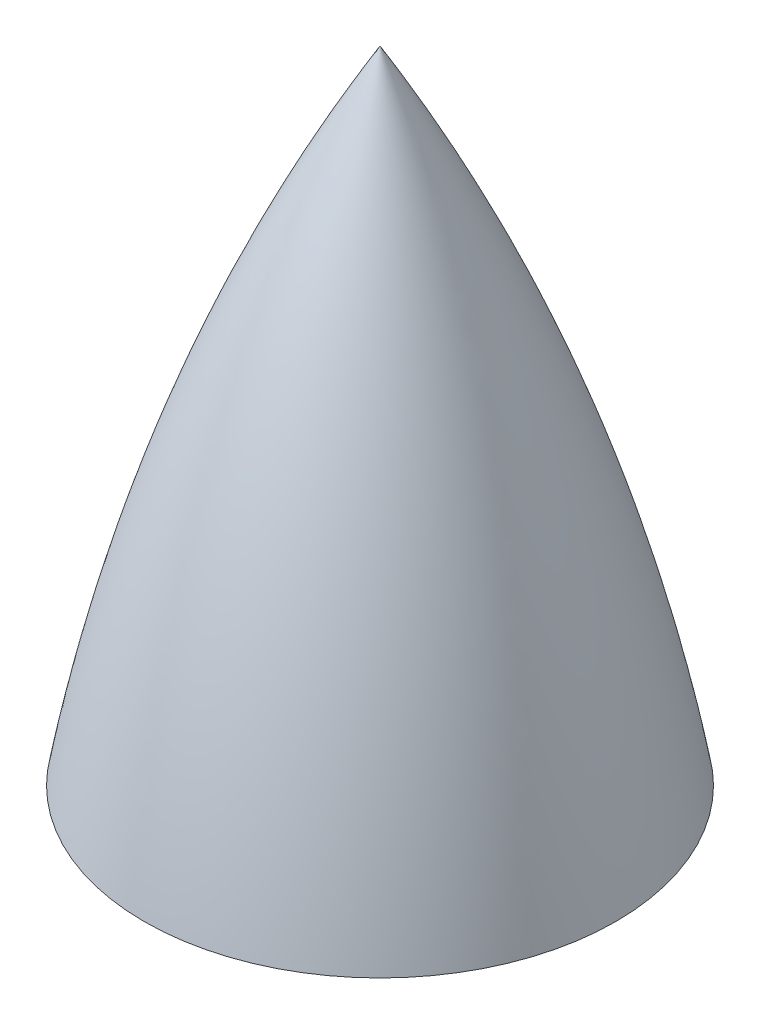
ISO-10303-21;
HEADER;
FILE_DESCRIPTION(('STEP AP214'),'2;1');
FILE_NAME('part.step','',(''),(''),'','','');
FILE_SCHEMA(('AUTOMOTIVE_DESIGN { 1 0 10303 214 1 1 1 1 }'));
ENDSEC;
DATA;
#1=APPLICATION_CONTEXT('core data for automotive mechanical design processes');
#2=APPLICATION_PROTOCOL_DEFINITION('international standard','automotive_design',2000,#1);
#3=PRODUCT_CONTEXT('',#1,'mechanical');
#4=PRODUCT('Part','Part','',(#3));
#5=PRODUCT_RELATED_PRODUCT_CATEGORY('part','',(#4));
#6=PRODUCT_DEFINITION_FORMATION('','',#4);
#7=PRODUCT_DEFINITION_CONTEXT('part definition',#1,'design');
#8=PRODUCT_DEFINITION('design','',#6,#7);
#9=PRODUCT_DEFINITION_SHAPE('','',#8);
#10=(LENGTH_UNIT() NAMED_UNIT(*) SI_UNIT(.MILLI.,.METRE.));
#11=(NAMED_UNIT(*) PLANE_ANGLE_UNIT() SI_UNIT($,.RADIAN.));
#12=(NAMED_UNIT(*) SI_UNIT($,.STERADIAN.) SOLID_ANGLE_UNIT());
#13=UNCERTAINTY_MEASURE_WITH_UNIT(LENGTH_MEASURE(1.E-05),#10,'distance_accuracy_value','');
#14=(GEOMETRIC_REPRESENTATION_CONTEXT(3) GLOBAL_UNCERTAINTY_ASSIGNED_CONTEXT((#13)) GLOBAL_UNIT_ASSIGNED_CONTEXT((#10,
#11,#12)) REPRESENTATION_CONTEXT('',''));
#15=CARTESIAN_POINT('',(0.,0.,0.));
#16=DIRECTION('',(0.,0.,1.));
#17=DIRECTION('',(1.,0.,0.));
#18=AXIS2_PLACEMENT_3D('',#15,#16,#17);
#19=CARTESIAN_POINT('',(-51.8,5.23291670442619,0.));
#20=DIRECTION('',(0.,1.,0.));
#21=DIRECTION('',(-1.,0.,0.));
#22=AXIS2_PLACEMENT_3D('',#19,#20,#21);
#23=PLANE('',#22);
#24=CARTESIAN_POINT('',(0.,5.23291670442619,0.));
#25=DIRECTION('',(0.,1.,0.));
#26=DIRECTION('',(-1.,0.,0.));
#27=AXIS2_PLACEMENT_3D('',#24,#25,#26);
#28=CIRCLE('',#27,55.);
#29=CARTESIAN_POINT('',(-55.,5.23291670442619,0.));
#30=VERTEX_POINT('',#29);
#31=EDGE_CURVE('E11',#30,#30,#28,.T.);
#32=ORIENTED_EDGE('',*,*,#31,.F.);
#33=EDGE_LOOP('',(#32));
#34=FACE_BOUND('',#33,.T.);
#35=CARTESIAN_POINT('',(0.,5.23291670442619,0.));
#36=DIRECTION('',(0.,1.,0.));
#37=DIRECTION('',(-1.,0.,0.));
#38=AXIS2_PLACEMENT_3D('',#35,#36,#37);
#39=CIRCLE('',#38,51.8);
#40=CARTESIAN_POINT('',(-51.8,5.23291670442619,0.));
#41=VERTEX_POINT('',#40);
#42=EDGE_CURVE('E58',#41,#41,#39,.T.);
#43=ORIENTED_EDGE('',*,*,#42,.T.);
#44=EDGE_LOOP('',(#43));
#45=FACE_BOUND('',#44,.T.);
#46=ADVANCED_FACE('F46',(#34,#45),#23,.F.);
#47=CARTESIAN_POINT('',(0.,149.475241281921,0.));
#48=CARTESIAN_POINT('',(-38.2411653020512,81.6235108823369,0.));
#49=CARTESIAN_POINT('',(-51.8,5.23291670442619,0.));
#50=B_SPLINE_CURVE_WITH_KNOTS('',2,(#47,#48,#49),.UNSPECIFIED.,.F.,.F.,(3,3),(0.,1.),.UNSPECIFIED.);
#51=CARTESIAN_POINT('',(0.,154.591981723671,0.));
#52=DIRECTION('',(0.,1.,0.));
#53=AXIS1_PLACEMENT('',#51,#52);
#54=SURFACE_OF_REVOLUTION('',#50,#53);
#55=ORIENTED_EDGE('',*,*,#42,.F.);
#56=EDGE_LOOP('',(#55));
#57=FACE_BOUND('',#56,.T.);
#58=CARTESIAN_POINT('',(-33.3390978625183,75.909034202137,0.));
#59=CARTESIAN_POINT('',(-33.3391045656254,75.9090330205368,-0.867979774072332));
#60=CARTESIAN_POINT('',(-33.3029575918185,75.9154067099841,-1.73585552885516));
#61=CARTESIAN_POINT('',(-33.1586489808093,75.9408522136266,-3.4656956056568));
#62=CARTESIAN_POINT('',(-33.0504684150183,75.9599273654418,-4.32765831371415));
#63=CARTESIAN_POINT('',(-32.7627508456799,76.0106597352109,-6.04017126253381));
#64=CARTESIAN_POINT('',(-32.5831357522762,76.0423307225144,-6.89070795736923));
#65=CARTESIAN_POINT('',(-32.1539625083414,76.1180055449604,-8.57332742574391));
#66=CARTESIAN_POINT('',(-31.9044089622886,76.1620085682092,-9.40541141024811));
#67=CARTESIAN_POINT('',(-31.3375021591597,76.2619695331103,-11.0446696532443));
#68=CARTESIAN_POINT('',(-31.0202025253331,76.3179180195369,-11.8518630384976));
#69=CARTESIAN_POINT('',(-30.3201029928275,76.4413644563096,-13.4364176614086));
#70=CARTESIAN_POINT('',(-29.9373021534747,76.5088625725218,-14.2137784704393));
#71=CARTESIAN_POINT('',(-29.1091883302709,76.6548813826481,-15.7331283944811));
#72=CARTESIAN_POINT('',(-28.6638900345743,76.7333994866441,-16.475125765878));
#73=CARTESIAN_POINT('',(-27.7140291240313,76.9008855930944,-17.9189106312184));
#74=CARTESIAN_POINT('',(-27.2094663274143,76.9898536275997,-18.6206980018237));
#75=CARTESIAN_POINT('',(-26.1403321573113,77.1783708277866,-19.9850473142587));
#76=CARTESIAN_POINT('',(-25.575295018701,77.2780021204263,-20.6472329189238));
#77=CARTESIAN_POINT('',(-24.3928829347699,77.4864932731398,-21.9215216319623));
#78=CARTESIAN_POINT('',(-23.7755077360001,77.5953531779034,-22.5336244977801));
#79=CARTESIAN_POINT('',(-22.4928343923468,77.8215230958258,-23.7037721132169));
#80=CARTESIAN_POINT('',(-21.8275319971561,77.9388338584282,-24.2618120580815));
#81=CARTESIAN_POINT('',(-20.453796612432,78.1810604711097,-25.3201635232266));
#82=CARTESIAN_POINT('',(-19.7453632037251,78.3059763951004,-25.8204744823248));
#83=CARTESIAN_POINT('',(-18.2794800821418,78.5644511400015,-26.7671948467975));
#84=CARTESIAN_POINT('',(-17.5214566814593,78.6981111175507,-27.2126885047088));
#85=CARTESIAN_POINT('',(-15.9715189143663,78.971406964309,-28.0380477362903));
#86=CARTESIAN_POINT('',(-15.1796042408283,79.1110428876731,-28.4179127150671));
#87=CARTESIAN_POINT('',(-13.5674145924137,79.3953154207084,-29.1096155849006));
#88=CARTESIAN_POINT('',(-12.7471378866126,79.5399523355883,-29.4214493155154));
#89=CARTESIAN_POINT('',(-11.0839811421251,79.8332117427896,-29.9751008499037));
#90=CARTESIAN_POINT('',(-10.2411009258116,79.9818342664315,-30.2169181032843));
#91=CARTESIAN_POINT('',(-8.52636163601416,80.2841890681046,-30.6319804205765));
#92=CARTESIAN_POINT('',(-7.65426048714819,80.437964030557,-30.8041948587747));
#93=CARTESIAN_POINT('',(-5.89892550754302,80.7474769476437,-31.0739461899926));
#94=CARTESIAN_POINT('',(-5.01569156704864,80.9032149216308,-31.171482346193));
#95=CARTESIAN_POINT('',(-3.24424595580308,81.215568577752,-31.2912645752408));
#96=CARTESIAN_POINT('',(-2.35603406274825,81.3721842990842,-31.3135072583867));
#97=CARTESIAN_POINT('',(-0.580885466582036,81.685190891356,-31.2825558113269));
#98=CARTESIAN_POINT('',(0.306051233223599,81.8415817617127,-31.2293614859131));
#99=CARTESIAN_POINT('',(2.07911278556175,82.1542203518478,-31.047188124951));
#100=CARTESIAN_POINT('',(2.96518103179961,82.310458090409,-30.9176403735178));
#101=CARTESIAN_POINT('',(4.72341221208547,82.6204816858173,-30.5831417375064));
#102=CARTESIAN_POINT('',(5.59557505418572,82.7742675264514,-30.3781903545466));
#103=CARTESIAN_POINT('',(7.31974853320821,83.078285830226,-29.8942103160308));
#104=CARTESIAN_POINT('',(8.17175896389443,83.2285182570015,-29.6151809027309));
#105=CARTESIAN_POINT('',(9.84945560777473,83.5243414407626,-28.9848698320725));
#106=CARTESIAN_POINT('',(10.675141938953,83.6699322185519,-28.6335884985985));
#107=CARTESIAN_POINT('',(12.2920014838693,83.9550281803376,-27.8621242549295));
#108=CARTESIAN_POINT('',(13.0832608122219,84.0945485486638,-27.4421274655278));
#109=CARTESIAN_POINT('',(14.6277756243239,84.3668881821421,-26.5353696963413));
#110=CARTESIAN_POINT('',(15.3810310935059,84.4997074447255,-26.0486086909652));
#111=CARTESIAN_POINT('',(16.8438855977865,84.7576481626819,-25.0116322657778));
#112=CARTESIAN_POINT('',(17.5534862711388,84.8827699069232,-24.4614192293907));
#113=CARTESIAN_POINT('',(18.9236785487163,85.1243717742193,-23.3013049551382));
#114=CARTESIAN_POINT('',(19.5842706553073,85.2408519858547,-22.6914043292535));
#115=CARTESIAN_POINT('',(20.8438159927327,85.462943812269,-21.4237694133546));
#116=CARTESIAN_POINT('',(21.4434092221525,85.5686682760662,-20.7666907695629));
#117=CARTESIAN_POINT('',(22.5852006098291,85.7699969040547,-19.4029759129949));
#118=CARTESIAN_POINT('',(23.1273991317554,85.8656011323709,-18.6963400142749));
#119=CARTESIAN_POINT('',(24.1501566148264,86.0459408713584,-17.2385445804225));
#120=CARTESIAN_POINT('',(24.6307197326704,86.1306771149679,-16.4873880527678));
#121=CARTESIAN_POINT('',(25.5264578782687,86.2886199176871,-14.9458950023414));
#122=CARTESIAN_POINT('',(25.941633647557,86.3618266075493,-14.1555589240244));
#123=CARTESIAN_POINT('',(26.6972355926676,86.4950596171485,-12.5542705583192));
#124=CARTESIAN_POINT('',(27.038743179629,86.5552766188466,-11.7438442790959));
#125=CARTESIAN_POINT('',(27.6525423647945,86.6635059759285,-10.0964007412647));
#126=CARTESIAN_POINT('',(27.9248346795415,86.7115184576581,-9.25938375803485));
#127=CARTESIAN_POINT('',(28.3980328625579,86.7949560645464,-7.56485180677454));
#128=CARTESIAN_POINT('',(28.5989433570014,86.8303820054244,-6.70733817095436));
#129=CARTESIAN_POINT('',(28.9277974674068,86.8883678578059,-4.97800330764798));
#130=CARTESIAN_POINT('',(29.0557415894491,86.9109278585451,-4.1061821794389));
#131=CARTESIAN_POINT('',(29.2364895421421,86.9427985993128,-2.36567709036357));
#132=CARTESIAN_POINT('',(29.2902210746168,86.9522729182029,-1.49709233822113));
#133=CARTESIAN_POINT('',(29.3251274106229,86.9584278470385,0.241574341554131));
#134=CARTESIAN_POINT('',(29.3063029039545,86.9551085786143,1.11165625487464));
#135=CARTESIAN_POINT('',(29.1962477897447,86.9357028926141,2.84705502994566));
#136=CARTESIAN_POINT('',(29.1050195334294,86.9196168896227,3.71237204551181));
#137=CARTESIAN_POINT('',(28.8508754453666,86.8748044299095,5.43208131002322));
#138=CARTESIAN_POINT('',(28.6879595926616,86.8460779694924,6.28647355577461));
#139=CARTESIAN_POINT('',(28.2924501098097,86.7763389765394,7.97510302517676));
#140=CARTESIAN_POINT('',(28.0601175947838,86.7353724856443,8.80940333575099));
#141=CARTESIAN_POINT('',(27.5273503243779,86.641431241433,10.4552655537757));
#142=CARTESIAN_POINT('',(27.2269158593467,86.5884565393132,11.2668275581529));
#143=CARTESIAN_POINT('',(26.560232276727,86.4709022361016,12.8615861986715));
#144=CARTESIAN_POINT('',(26.1939824668731,86.4063225129448,13.6447825363501));
#145=CARTESIAN_POINT('',(25.3984318707414,86.2660454783276,15.1774269543634));
#146=CARTESIAN_POINT('',(24.9691306671369,86.1903480932813,15.9268748112796));
#147=CARTESIAN_POINT('',(24.0475960269438,86.0278566725573,17.3918355557631));
#148=CARTESIAN_POINT('',(23.5549603072755,85.9409917035187,18.1070875067309));
#149=CARTESIAN_POINT('',(22.5126967663455,85.7572125202435,19.4934019280248));
#150=CARTESIAN_POINT('',(21.9630687919679,85.6602982790083,20.1644642796226));
#151=CARTESIAN_POINT('',(20.8108222019037,85.45712611675,21.4579633137081));
#152=CARTESIAN_POINT('',(20.2082011044806,85.3508677581298,22.0803977163054));
#153=CARTESIAN_POINT('',(18.9543374702073,85.1297777692776,23.2725333450623));
#154=CARTESIAN_POINT('',(18.3030944611302,85.0149460557792,23.8422340589399));
#155=CARTESIAN_POINT('',(16.9471347106014,84.7758537670055,24.932853349057));
#156=CARTESIAN_POINT('',(16.2417945341881,84.6514832633257,25.4529728115843));
#157=CARTESIAN_POINT('',(14.7909463768884,84.3956595882818,26.4318164964166));
#158=CARTESIAN_POINT('',(14.0454380660753,84.2642063587427,26.8905402143313));
#159=CARTESIAN_POINT('',(12.5194930810633,83.9951410868075,27.7436738305854));
#160=CARTESIAN_POINT('',(11.7390542526843,83.8575286645713,28.1380797554345));
#161=CARTESIAN_POINT('',(10.1487486824704,83.5771148849707,28.860049527611));
#162=CARTESIAN_POINT('',(9.33888167980631,83.4343134816151,29.187612782325));
#163=CARTESIAN_POINT('',(7.68268956970601,83.1422821273671,29.7783510693503));
#164=CARTESIAN_POINT('',(6.83599559401702,82.9929871350493,30.040460180742));
#165=CARTESIAN_POINT('',(5.12401129697342,82.6911181129304,30.4919810153136));
#166=CARTESIAN_POINT('',(4.25872078611678,82.5385440497149,30.6813919973153));
#167=CARTESIAN_POINT('',(2.51555465453599,82.231176828859,30.9863245274382));
#168=CARTESIAN_POINT('',(1.63767832844585,82.0763835468436,31.1018419175468));
#169=CARTESIAN_POINT('',(-0.124498553446834,81.7656642177842,31.2582421675711));
#170=CARTESIAN_POINT('',(-1.00879913731938,81.6097381657907,31.299124701182));
#171=CARTESIAN_POINT('',(-2.78657739048763,81.2962678940394,31.3060289145664));
#172=CARTESIAN_POINT('',(-3.68005799920503,81.1387231559823,31.2712943449618));
#173=CARTESIAN_POINT('',(-5.46098173463419,80.8246982508411,31.125634454295));
#174=CARTESIAN_POINT('',(-6.34842481322489,80.668218092242,31.0147085266801));
#175=CARTESIAN_POINT('',(-8.11098472736792,80.3574312242624,30.717370077456));
#176=CARTESIAN_POINT('',(-8.9861012836345,80.2031245641275,30.5309558483234));
#177=CARTESIAN_POINT('',(-10.7177333193745,79.8977911155664,30.0838401675065));
#178=CARTESIAN_POINT('',(-11.5742488450839,79.7467643189877,29.8231389004982));
#179=CARTESIAN_POINT('',(-13.2628189198231,79.4490238559934,29.229034294176));
#180=CARTESIAN_POINT('',(-14.0948645371117,79.3023117644847,28.8956047731516));
#181=CARTESIAN_POINT('',(-15.7281175816094,79.0143251864146,28.1582887083187));
#182=CARTESIAN_POINT('',(-16.5293249311414,78.8730507135497,27.7544019870532));
#183=CARTESIAN_POINT('',(-18.0949460840126,78.5969894627298,26.8788903493538));
#184=CARTESIAN_POINT('',(-18.8593621836855,78.4622022798691,26.4072696678887));
#185=CARTESIAN_POINT('',(-20.3457393527171,78.200113881459,25.3994625823472));
#186=CARTESIAN_POINT('',(-21.0677008437685,78.0728125915537,24.8632768197434));
#187=CARTESIAN_POINT('',(-22.4569303239842,77.8278539517953,23.7355198143693));
#188=CARTESIAN_POINT('',(-23.1246605436407,77.7101150982351,23.1445356670188));
#189=CARTESIAN_POINT('',(-24.4080822965665,77.4838132155654,21.9069091581142));
#190=CARTESIAN_POINT('',(-25.0237738555156,77.3752501819278,21.2602668240265));
#191=CARTESIAN_POINT('',(-26.1985076574018,77.1681129175046,19.9157012278156));
#192=CARTESIAN_POINT('',(-26.7575386524883,77.0695406700185,19.2177678310085));
#193=CARTESIAN_POINT('',(-27.8144413491436,76.8831802086134,17.7756989598424));
#194=CARTESIAN_POINT('',(-28.3123147508968,76.795391694906,17.0315647707341));
#195=CARTESIAN_POINT('',(-29.2360851646562,76.6325060469819,15.513770504683));
#196=CARTESIAN_POINT('',(-29.6629383339536,76.5572403164369,14.74071037083));
#197=CARTESIAN_POINT('',(-30.4501754961652,76.4184291645132,13.1603821836474));
#198=CARTESIAN_POINT('',(-30.8105555592318,76.3548844360727,12.3531121113154));
#199=CARTESIAN_POINT('',(-31.46158017195,76.2400912317784,10.7111896296466));
#200=CARTESIAN_POINT('',(-31.752307978565,76.1888280754756,9.8765712813025));
#201=CARTESIAN_POINT('',(-32.262197050315,76.0989208748323,8.18539522657385));
#202=CARTESIAN_POINT('',(-32.4813783597036,76.060273296149,7.32884373756054));
#203=CARTESIAN_POINT('',(-32.8880686755704,75.9885628211886,5.40301143080623));
#204=CARTESIAN_POINT('',(-33.0570455812643,75.9587676344937,4.3296432212827));
#205=CARTESIAN_POINT('',(-33.2825553792746,75.9190041703259,2.17079571005842));
#206=CARTESIAN_POINT('',(-33.3390894809947,75.9090356796026,1.08531653874612));
#207=CARTESIAN_POINT('',(-33.3390978625183,75.909034202137,0.));
#208=B_SPLINE_CURVE_WITH_KNOTS('',3,(#58,#59,#60,#61,#62,#63,#64,#65,#66,#67,#68,#69,#70,#71,
#72,#73,#74,#75,#76,#77,#78,#79,#80,#81,#82,#83,#84,#85,#86,#87,#88,#89,#90,#91,#92,#93,#94,#95,
#96,#97,#98,#99,#100,#101,#102,#103,#104,#105,#106,#107,#108,#109,#110,#111,#112,#113,#114,#115,
#116,#117,#118,#119,#120,#121,#122,#123,#124,#125,#126,#127,#128,#129,#130,#131,#132,#133,#134,
#135,#136,#137,#138,#139,#140,#141,#142,#143,#144,#145,#146,#147,#148,#149,#150,#151,#152,#153,
#154,#155,#156,#157,#158,#159,#160,#161,#162,#163,#164,#165,#166,#167,#168,#169,#170,#171,#172,
#173,#174,#175,#176,#177,#178,#179,#180,#181,#182,#183,#184,#185,#186,#187,#188,#189,#190,#191,
#192,#193,#194,#195,#196,#197,#198,#199,#200,#201,#202,#203,#204,#205,#206,#207),.UNSPECIFIED.,
.T.,.F.,(4,2,2,2,2,2,2,2,2,2,2,2,2,2,2,2,2,2,2,2,2,2,2,2,2,2,2,2,2,2,2,2,2,2,2,2,2,2,2,2,2,2,2,
2,2,2,2,2,2,2,2,2,2,2,2,2,2,2,2,2,2,2,2,2,2,2,2,2,2,2,2,2,2,2,4),(0.,2.60298531183563,
5.20665489182676,7.81317857505401,10.4195306951032,13.0238273999141,15.6281615086071,
18.2318845683549,20.8356156142116,23.4610813981591,26.0865598967442,28.7122715168253,
31.3380086592457,34.0029280506111,36.6678715969624,39.3329780719237,41.9981054964647,
44.7013652208028,47.4046516167262,50.1080597126005,52.8114748040867,55.5352853035439,
58.2591138063972,60.9829701723533,63.7068143283129,66.4233993159685,69.1399853449175,
71.8564693650133,74.5729255357377,77.2570533688746,79.9411641935821,82.6250939062325,
85.3089931792258,87.9503120484076,90.5916035725357,93.2327238863463,95.8738258816408,
98.4816042107083,101.089357747331,103.697026603703,106.304696222413,108.902677843075,
111.500648387603,114.098646259959,116.696661328807,119.31207893899,121.92750357596,
124.543050761939,127.158623354003,129.810995772794,132.463389980536,135.115947988569,
137.768529512608,140.461841718203,143.155181382155,145.84867258774,148.542175569288,
151.262740018923,153.983326126987,156.703973777361,159.424614664324,162.14623658598,
164.867865362551,167.589324047207,170.310755695618,173.005814008357,175.700870991142,
178.396461933834,181.091977921988,183.747602114199,186.403383254936,189.055973860665,
191.707820685424,194.962612420812,198.217369148373),.UNSPECIFIED.);
#209=CARTESIAN_POINT('',(-33.3390978625183,75.909034202137,0.));
#210=VERTEX_POINT('',#209);
#211=EDGE_CURVE('E78',#210,#210,#208,.T.);
#212=ORIENTED_EDGE('',*,*,#211,.F.);
#213=EDGE_LOOP('',(#212));
#214=FACE_BOUND('',#213,.T.);
#215=ADVANCED_FACE('F73',(#57,#214),#54,.T.);
#216=CARTESIAN_POINT('',(-13.9865061882207,79.3214182649793,0.));
#217=DIRECTION('',(-0.173648177667456,0.984807753012116,0.));
#218=DIRECTION('',(-0.984807753012116,-0.173648177667456,0.));
#219=AXIS2_PLACEMENT_3D('',#216,#217,#218);
#220=PLANE('',#219);
#221=ORIENTED_EDGE('',*,*,#211,.T.);
#222=EDGE_LOOP('',(#221));
#223=FACE_BOUND('',#222,.T.);
#224=ADVANCED_FACE('F68',(#223),#220,.F.);
#225=CARTESIAN_POINT('',(0.,154.591981723671,0.));
#226=CARTESIAN_POINT('',(-40.8028473509364,84.7709176300479,0.));
#227=CARTESIAN_POINT('',(-55.,5.23291670442619,0.));
#228=B_SPLINE_CURVE_WITH_KNOTS('',2,(#225,#226,#227),.UNSPECIFIED.,.F.,.F.,(3,3),(0.,1.),.UNSPECIFIED.);
#229=CARTESIAN_POINT('',(0.,154.591981723671,0.));
#230=DIRECTION('',(0.,1.,0.));
#231=AXIS1_PLACEMENT('',#229,#230);
#232=SURFACE_OF_REVOLUTION('',#228,#231);
#233=CARTESIAN_POINT('',(0.,154.591981723671,0.));
#234=VERTEX_POINT('',#233);
#235=VERTEX_LOOP('',#234);
#236=FACE_BOUND('',#235,.T.);
#237=ORIENTED_EDGE('',*,*,#31,.T.);
#238=EDGE_LOOP('',(#237));
#239=FACE_BOUND('',#238,.T.);
#240=ADVANCED_FACE('F65',(#236,#239),#232,.F.);
#241=CLOSED_SHELL('',(#46,#215,#224,#240));
#242=CARTESIAN_POINT('',(0.,149.475241281921,0.));
#243=CARTESIAN_POINT('',(-38.2411653020512,81.6235108823369,0.));
#244=CARTESIAN_POINT('',(-51.8,5.23291670442619,0.));
#245=B_SPLINE_CURVE_WITH_KNOTS('',2,(#242,#243,#244),.UNSPECIFIED.,.F.,.F.,(3,3),(0.,1.),.UNSPECIFIED.);
#246=CARTESIAN_POINT('',(0.,154.591981723671,0.));
#247=DIRECTION('',(0.,1.,0.));
#248=AXIS1_PLACEMENT('',#246,#247);
#249=SURFACE_OF_REVOLUTION('',#245,#248);
#250=CARTESIAN_POINT('',(0.,149.475241281921,0.));
#251=VERTEX_POINT('',#250);
#252=VERTEX_LOOP('',#251);
#253=FACE_BOUND('',#252,.T.);
#254=CARTESIAN_POINT('',(-32.5758263209757,78.0744727971338,0.));
#255=CARTESIAN_POINT('',(-32.5758328676461,78.0744716427097,-0.847200387708758));
#256=CARTESIAN_POINT('',(-32.5405509402664,78.0806927978852,-1.69429922897805));
#257=CARTESIAN_POINT('',(-32.3996959639456,78.1055293301728,-3.38272689930042));
#258=CARTESIAN_POINT('',(-32.2941044403522,78.1241479648647,-4.22405415308511));
#259=CARTESIAN_POINT('',(-32.0132731459441,78.1736660992049,-5.89556921217022));
#260=CARTESIAN_POINT('',(-31.8379571618832,78.2045790373046,-6.72574379697091));
#261=CARTESIAN_POINT('',(-31.4190570997797,78.278442420445,-8.3680808981495));
#262=CARTESIAN_POINT('',(-31.1754775154992,78.3213920731142,-9.18024459637947));
#263=CARTESIAN_POINT('',(-30.6221435484324,78.4189597808586,-10.7802576280251));
#264=CARTESIAN_POINT('',(-30.3124416230462,78.4735685862789,-11.5681256723608));
#265=CARTESIAN_POINT('',(-29.6291079375837,78.5940587518512,-13.1147450377861));
#266=CARTESIAN_POINT('',(-29.2554752599662,78.6599402737904,-13.8734959407918));
#267=CARTESIAN_POINT('',(-28.4471973981012,78.8024614687476,-15.3564752086944));
#268=CARTESIAN_POINT('',(-28.012566541453,78.8790986154231,-16.0807116271906));
#269=CARTESIAN_POINT('',(-27.0854631134389,79.0425719636897,-17.4899407736369));
#270=CARTESIAN_POINT('',(-26.5929903623084,79.1294081969781,-18.174933379613));
#271=CARTESIAN_POINT('',(-25.5494506248296,79.3134124081376,-19.5066714344849));
#272=CARTESIAN_POINT('',(-24.9979262542213,79.4106610351944,-20.153047331963));
#273=CARTESIAN_POINT('',(-23.8437922769923,79.6141659947329,-21.3969174120234));
#274=CARTESIAN_POINT('',(-23.2411824216576,79.7204223710695,-21.9944113565919));
#275=CARTESIAN_POINT('',(-21.9891870202583,79.9411829400598,-23.1366386234755));
#276=CARTESIAN_POINT('',(-21.3397973130633,80.055687866433,-23.6813672421143));
#277=CARTESIAN_POINT('',(-19.9989201643373,80.2921206855696,-24.714482757247));
#278=CARTESIAN_POINT('',(-19.3074323116186,80.4140486508365,-25.2028691032906));
#279=CARTESIAN_POINT('',(-17.8765560508374,80.6663507416682,-26.1270749153076));
#280=CARTESIAN_POINT('',(-17.1366046252865,80.7968241424069,-26.5619957586352));
#281=CARTESIAN_POINT('',(-15.6236168180929,81.0636047142989,-27.3677780236266));
#282=CARTESIAN_POINT('',(-14.8505801350097,81.1999119386043,-27.7386388614835));
#283=CARTESIAN_POINT('',(-13.2768201358142,81.4774082876231,-28.4139605349007));
#284=CARTESIAN_POINT('',(-12.4760951209119,81.618597711879,-28.7184172879007));
#285=CARTESIAN_POINT('',(-10.8525778322629,81.9048676135153,-29.2589901736582));
#286=CARTESIAN_POINT('',(-10.0297853842105,82.0499481216306,-29.4951057664306));
#287=CARTESIAN_POINT('',(-8.35584365446597,82.3451092127193,-29.9004230473249));
#288=CARTESIAN_POINT('',(-7.50445671357615,82.4952317014215,-30.0686132392803));
#289=CARTESIAN_POINT('',(-5.79080941781647,82.7973939550829,-30.3320924875181));
#290=CARTESIAN_POINT('',(-4.92854895517215,82.9494337390458,-30.4273808206452));
#291=CARTESIAN_POINT('',(-3.19916273792822,83.2543711892122,-30.5444583410827));
#292=CARTESIAN_POINT('',(-2.33203676480741,83.4072688939469,-30.5662442003305));
#293=CARTESIAN_POINT('',(-0.599023676200904,83.7128458593901,-30.5361731127596));
#294=CARTESIAN_POINT('',(0.266863436054704,83.865525119529,-30.48431597428));
#295=CARTESIAN_POINT('',(1.99788827190564,84.1707515023669,-30.3066153661668));
#296=CARTESIAN_POINT('',(2.86297047193332,84.3232888347629,-30.1802135722032));
#297=CARTESIAN_POINT('',(4.57956532844743,84.6259708229127,-29.8537921883496));
#298=CARTESIAN_POINT('',(5.43107789470828,84.7761154627572,-29.6537721091788));
#299=CARTESIAN_POINT('',(7.11443429155235,85.07293661367,-29.1814073799003));
#300=CARTESIAN_POINT('',(7.94627791961685,85.2196130890286,-28.909061985457));
#301=CARTESIAN_POINT('',(9.58426994060005,85.508435276514,-28.2938270494256));
#302=CARTESIAN_POINT('',(10.3904184492954,85.6505810090553,-27.9509378257446));
#303=CARTESIAN_POINT('',(11.9690139788555,85.9289299925434,-27.1978897998706));
#304=CARTESIAN_POINT('',(12.7415454730712,86.0651481384211,-26.7879136098968));
#305=CARTESIAN_POINT('',(14.2495089660276,86.3310427881535,-25.9027739350943));
#306=CARTESIAN_POINT('',(14.9849409504021,86.4607192894751,-25.4276104250229));
#307=CARTESIAN_POINT('',(16.413185018914,86.7125572537914,-24.4153261742812));
#308=CARTESIAN_POINT('',(17.1059987111565,86.8347190003384,-23.8782077735404));
#309=CARTESIAN_POINT('',(18.4437785525721,87.0706056806286,-22.745689495556));
#310=CARTESIAN_POINT('',(19.0887451950182,87.1843307013491,-22.1502902192985));
#311=CARTESIAN_POINT('',(20.3184582234563,87.4011622867922,-20.9128223137072));
#312=CARTESIAN_POINT('',(20.9038328036512,87.5043796191017,-20.2713973118183));
#313=CARTESIAN_POINT('',(22.0185499575076,87.7009343291858,-18.9401614460301));
#314=CARTESIAN_POINT('',(22.5478928880789,87.7942717698931,-18.2503508903831));
#315=CARTESIAN_POINT('',(23.546400803454,87.9703356558252,-16.8272580370843));
#316=CARTESIAN_POINT('',(24.0155698695961,88.0530628207001,-16.0939786926743));
#317=CARTESIAN_POINT('',(24.890068630796,88.2072605468963,-14.5891647263868));
#318=CARTESIAN_POINT('',(25.2953990540364,88.2787312366158,-13.8176305409994));
#319=CARTESIAN_POINT('',(26.0330471519131,88.4087984985401,-12.2544974931541));
#320=CARTESIAN_POINT('',(26.3664263210804,88.4675822408707,-11.4634149858462));
#321=CARTESIAN_POINT('',(26.9656165934037,88.5732356524596,-9.85529032586325));
#322=CARTESIAN_POINT('',(27.2314283998742,88.6201054457314,-9.03824844350108));
#323=CARTESIAN_POINT('',(27.6933639070014,88.7015571389854,-7.38415338472073));
#324=CARTESIAN_POINT('',(27.8894921487383,88.7361398396827,-6.54710151609213));
#325=CARTESIAN_POINT('',(28.2105169120558,88.7927451669313,-4.85902966641626));
#326=CARTESIAN_POINT('',(28.335413930463,88.8147678810866,-4.00800978283626));
#327=CARTESIAN_POINT('',(28.5118479698254,88.8458779625416,-2.30908957592349));
#328=CARTESIAN_POINT('',(28.5642954841812,88.8551258743937,-1.46128662289655));
#329=CARTESIAN_POINT('',(28.598368172697,88.8611338086843,0.235780710398868));
#330=CARTESIAN_POINT('',(28.5799940238378,88.8578939504929,1.08504507662021));
#331=CARTESIAN_POINT('',(28.4725704968242,88.8389522843174,2.77892244283418));
#332=CARTESIAN_POINT('',(28.3835234256241,88.8232508831117,3.6235355937488));
#333=CARTESIAN_POINT('',(28.1354557601353,88.7795098606446,5.30209814704418));
#334=CARTESIAN_POINT('',(27.9764351452606,88.7514702357532,6.13604754628762));
#335=CARTESIAN_POINT('',(27.5903865766129,88.6833994572365,7.78425669617654));
#336=CARTESIAN_POINT('',(27.3636148544059,88.6434134841496,8.59857835500251));
#337=CARTESIAN_POINT('',(26.8436014667232,88.5517210935712,10.20502805893));
#338=CARTESIAN_POINT('',(26.5503600861279,88.5000147263119,10.9971561991337));
#339=CARTESIAN_POINT('',(25.8996409685995,88.3852753890285,12.5537273727668));
#340=CARTESIAN_POINT('',(25.5421625524052,88.3222422992323,13.3181701133401));
#341=CARTESIAN_POINT('',(24.7656676619556,88.1853252996634,14.8141174281808));
#342=CARTESIAN_POINT('',(24.3466507783183,88.1114413177055,15.545621783285));
#343=CARTESIAN_POINT('',(23.4471797853495,87.95284031328,16.975536481041));
#344=CARTESIAN_POINT('',(22.9663309784214,87.8680536949768,17.6736908123692));
#345=CARTESIAN_POINT('',(21.9490066169487,87.6886719619166,19.0268697414879));
#346=CARTESIAN_POINT('',(21.4125309121406,87.5940768206641,19.6818942227651));
#347=CARTESIAN_POINT('',(20.2878589569589,87.3957668105188,20.9444849683684));
#348=CARTESIAN_POINT('',(19.6996602724045,87.2920515124143,21.5520489965726));
#349=CARTESIAN_POINT('',(18.4758074309193,87.076253236043,22.7157110670918));
#350=CARTESIAN_POINT('',(17.8401528108173,86.9641701761067,23.2718086069739));
#351=CARTESIAN_POINT('',(16.5166030402564,86.7307926412456,24.3364357181219));
#352=CARTESIAN_POINT('',(15.828096167043,86.6093903030945,24.8441812444916));
#353=CARTESIAN_POINT('',(14.4118725053277,86.3596718608156,25.7997462294912));
#354=CARTESIAN_POINT('',(13.6841553930775,86.2313556996022,26.2475651932176));
#355=CARTESIAN_POINT('',(12.1946253762323,85.9687113690564,27.0804296112038));
#356=CARTESIAN_POINT('',(11.4328103579887,85.8343828270308,27.465471167153));
#357=CARTESIAN_POINT('',(9.88045349382579,85.56066042819,28.1703139618381));
#358=CARTESIAN_POINT('',(9.08991139200317,85.4212665262522,28.4901146192346));
#359=CARTESIAN_POINT('',(7.47317066035409,85.1361915144513,29.0668966080215));
#360=CARTESIAN_POINT('',(6.64660997768475,84.9904465649034,29.3228319242462));
#361=CARTESIAN_POINT('',(4.97533038230293,84.6957548799292,29.7637371890153));
#362=CARTESIAN_POINT('',(4.13061128357743,84.5468081117036,29.9487064102237));
#363=CARTESIAN_POINT('',(2.42888245067912,84.2467474046132,30.2465162253193));
#364=CARTESIAN_POINT('',(1.5718720240332,84.0956333436466,30.3593527389187));
#365=CARTESIAN_POINT('',(-0.148425462188058,83.7922984819799,30.5121697661663));
#366=CARTESIAN_POINT('',(-1.01171254934442,83.6400776764165,30.5521499594734));
#367=CARTESIAN_POINT('',(-2.74730061950951,83.3340466722497,30.5590340590294));
#368=CARTESIAN_POINT('',(-3.61960454828842,83.1802359542275,30.5251955475884));
#369=CARTESIAN_POINT('',(-5.35832418152022,82.8736527710003,30.3831341586597));
#370=CARTESIAN_POINT('',(-6.22473983878232,82.7208803141162,30.2749106857319));
#371=CARTESIAN_POINT('',(-7.94554334758001,82.4174562270165,29.9847659300231));
#372=CARTESIAN_POINT('',(-8.79993092497958,82.2668046451383,29.802842970337));
#373=CARTESIAN_POINT('',(-10.4905518524037,81.9687025614821,29.3664690366352));
#374=CARTESIAN_POINT('',(-11.326785247751,81.8212520517125,29.1120182437114));
#375=CARTESIAN_POINT('',(-12.9753807185278,81.5305601899399,28.5321333659306));
#376=CARTESIAN_POINT('',(-13.7877339479646,81.3873203977241,28.2066733437435));
#377=CARTESIAN_POINT('',(-15.3823374983826,81.106148768251,27.4869611713224));
#378=CARTESIAN_POINT('',(-16.1645877430689,80.9682169444465,27.092708846751));
#379=CARTESIAN_POINT('',(-17.6931697092039,80.6986867015917,26.2380650821005));
#380=CARTESIAN_POINT('',(-18.4395036765481,80.5670878865293,25.7776777847279));
#381=CARTESIAN_POINT('',(-19.8907241580944,80.3111985606752,24.7938600225659));
#382=CARTESIAN_POINT('',(-20.5956110860556,80.1869079769265,24.2704301872792));
#383=CARTESIAN_POINT('',(-21.9519524991559,79.947748390744,23.1695162408974));
#384=CARTESIAN_POINT('',(-22.6038605877634,79.83279940578,22.5926083436115));
#385=CARTESIAN_POINT('',(-23.856873779022,79.6118593729768,21.3844494399492));
#386=CARTESIAN_POINT('',(-24.4579789078451,79.5058683205228,20.7531984615688));
#387=CARTESIAN_POINT('',(-25.6048827063941,79.3036382365609,19.4406262012279));
#388=CARTESIAN_POINT('',(-26.150670413406,79.2074011380753,18.7592950404373));
#389=CARTESIAN_POINT('',(-27.1825343434055,79.0254556867961,17.3515201787511));
#390=CARTESIAN_POINT('',(-27.6686122305499,78.9397470405667,16.6250777359903));
#391=CARTESIAN_POINT('',(-28.5704556436212,78.780727714467,15.143422732681));
#392=CARTESIAN_POINT('',(-28.9871599426192,78.7072515035756,14.3887992514538));
#393=CARTESIAN_POINT('',(-29.7556800689248,78.5717406700918,12.8461554418176));
#394=CARTESIAN_POINT('',(-30.107492062505,78.5097067234891,12.0581331436431));
#395=CARTESIAN_POINT('',(-30.7430372269156,78.3976429635375,10.4553552917021));
#396=CARTESIAN_POINT('',(-31.0268517115451,78.3475988123719,9.64063300616496));
#397=CARTESIAN_POINT('',(-31.5246132384671,78.2598300252424,7.98976881060908));
#398=CARTESIAN_POINT('',(-31.7385798557769,78.2221019376747,7.15363297275018));
#399=CARTESIAN_POINT('',(-32.135570265356,78.1521018172764,5.27378924166214));
#400=CARTESIAN_POINT('',(-32.3005109636305,78.1230183217698,4.22609288486561));
#401=CARTESIAN_POINT('',(-32.5206343042782,78.0842046382151,2.11887800865874));
#402=CARTESIAN_POINT('',(-32.5758181348624,78.0744742406533,1.05935961735682));
#403=CARTESIAN_POINT('',(-32.5758263209757,78.0744727971338,0.));
#404=B_SPLINE_CURVE_WITH_KNOTS('',3,(#254,#255,#256,#257,#258,#259,#260,#261,#262,#263,#264,
#265,#266,#267,#268,#269,#270,#271,#272,#273,#274,#275,#276,#277,#278,#279,#280,#281,#282,#283,
#284,#285,#286,#287,#288,#289,#290,#291,#292,#293,#294,#295,#296,#297,#298,#299,#300,#301,#302,
#303,#304,#305,#306,#307,#308,#309,#310,#311,#312,#313,#314,#315,#316,#317,#318,#319,#320,#321,
#322,#323,#324,#325,#326,#327,#328,#329,#330,#331,#332,#333,#334,#335,#336,#337,#338,#339,#340,
#341,#342,#343,#344,#345,#346,#347,#348,#349,#350,#351,#352,#353,#354,#355,#356,#357,#358,#359,
#360,#361,#362,#363,#364,#365,#366,#367,#368,#369,#370,#371,#372,#373,#374,#375,#376,#377,#378,
#379,#380,#381,#382,#383,#384,#385,#386,#387,#388,#389,#390,#391,#392,#393,#394,#395,#396,#397,
#398,#399,#400,#401,#402,#403),.UNSPECIFIED.,.T.,.F.,(4,2,2,2,2,2,2,2,2,2,2,2,2,2,2,2,2,2,2,2,2,
2,2,2,2,2,2,2,2,2,2,2,2,2,2,2,2,2,2,2,2,2,2,2,2,2,2,2,2,2,2,2,2,2,2,2,2,2,2,2,2,2,2,2,2,2,2,2,2,
2,2,2,2,2,4),(0.,2.54066994994428,5.08200775362043,7.62613106874259,10.1700869446918,
12.712032052407,15.254013645457,17.7953991595954,20.3367925722088,22.8995307381481,
25.4622813817221,28.0252602675645,30.5882641909643,33.1897220387365,35.7912035934858,
38.3928450437196,40.9945070497791,43.6335968111403,46.272712750807,48.9119481833894,
51.551190484775,54.2104558184813,56.8697388264815,59.5290492035371,62.1883475966206,
64.8405241887046,67.4927018078074,70.1447792915114,72.7968294301642,75.4171482005141,
78.0374502789835,80.6575745393714,83.277668910852,85.8559702363147,88.4342447229191,
91.0123511598622,93.5904396147018,96.1358243227391,98.6811846996304,101.226461992531,
103.771740034243,106.307511249782,108.843271597536,111.379058760734,113.914862793905,
116.467742039496,119.020628181295,121.573634531085,124.126665801538,126.715806933073,
129.304969445708,131.894292677284,134.483638980427,137.112959317232,139.742306601384,
142.371802605092,145.001310170369,147.657385328952,150.313481749254,152.969638607858,
155.625788834467,158.282910894297,160.940039688051,163.597002111309,166.253938006032,
168.884992507109,171.516045652755,174.147619200729,176.779119388148,179.371455794967,
181.96394530361,184.553318973265,187.141966341045,190.318915175244,193.495829616091),.UNSPECIFIED.);
#405=CARTESIAN_POINT('',(-32.5758263209757,78.0744727971338,0.));
#406=VERTEX_POINT('',#405);
#407=EDGE_CURVE('E81',#406,#406,#404,.T.);
#408=ORIENTED_EDGE('',*,*,#407,.T.);
#409=EDGE_LOOP('',(#408));
#410=FACE_BOUND('',#409,.T.);
#411=ADVANCED_FACE('F48',(#253,#410),#249,.T.);
#412=CARTESIAN_POINT('',(-14.3338025435556,81.2910337710035,0.));
#413=DIRECTION('',(-0.173648177667456,0.984807753012116,0.));
#414=DIRECTION('',(-0.984807753012116,-0.173648177667456,0.));
#415=AXIS2_PLACEMENT_3D('',#412,#413,#414);
#416=PLANE('',#415);
#417=ORIENTED_EDGE('',*,*,#407,.F.);
#418=EDGE_LOOP('',(#417));
#419=FACE_BOUND('',#418,.T.);
#420=ADVANCED_FACE('F110',(#419),#416,.T.);
#421=CLOSED_SHELL('',(#411,#420));
#422=ORIENTED_CLOSED_SHELL('',*,#421,.T.);
#423=BREP_WITH_VOIDS('B2',#241,(#422));
#424=ADVANCED_BREP_SHAPE_REPRESENTATION('',(#18,#423),#14);
#425=SHAPE_DEFINITION_REPRESENTATION(#9,#424);
ENDSEC;
END-ISO-10303-21;
